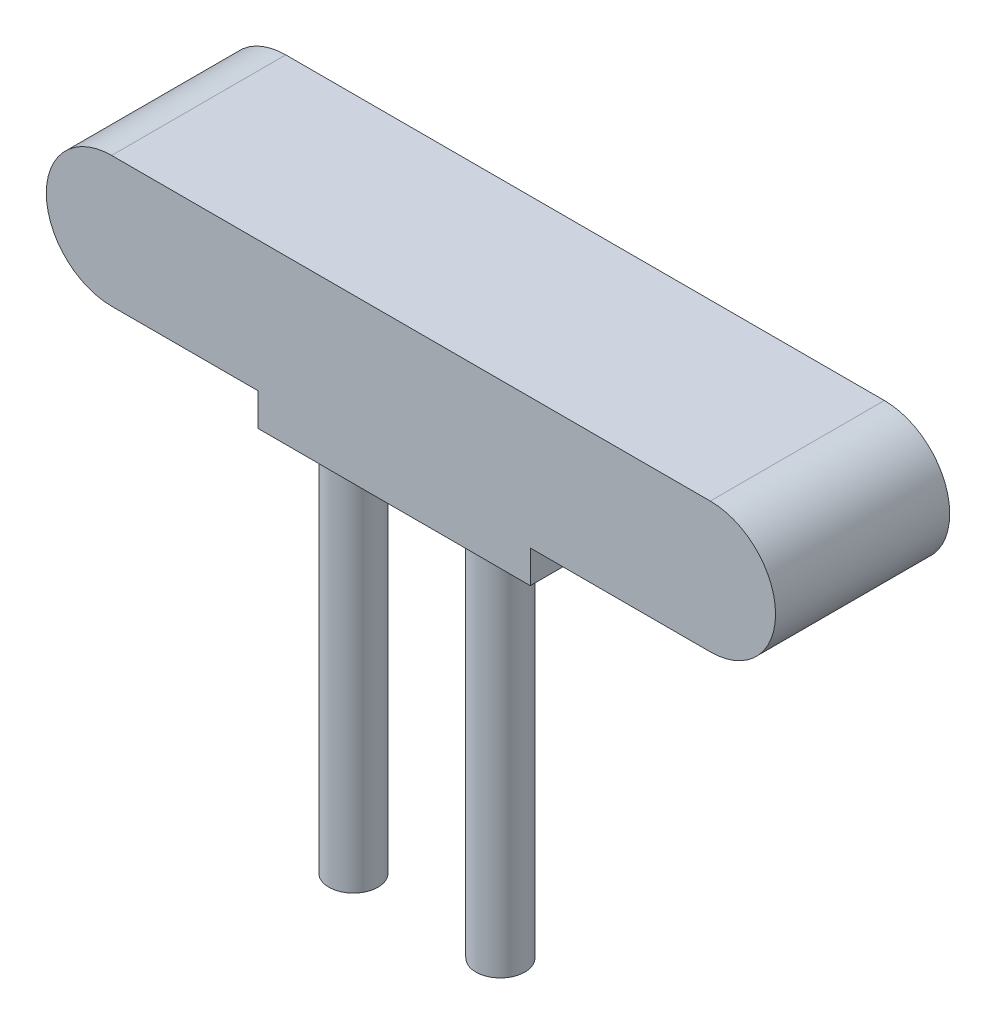
ISO-10303-21;
HEADER;
FILE_DESCRIPTION(('STEP AP214'),'2;1');
FILE_NAME('part.step','',(''),(''),'','','');
FILE_SCHEMA(('AUTOMOTIVE_DESIGN { 1 0 10303 214 1 1 1 1 }'));
ENDSEC;
DATA;
#1=APPLICATION_CONTEXT('core data for automotive mechanical design processes');
#2=APPLICATION_PROTOCOL_DEFINITION('international standard','automotive_design',2000,#1);
#3=PRODUCT_CONTEXT('',#1,'mechanical');
#4=PRODUCT('Part','Part','',(#3));
#5=PRODUCT_RELATED_PRODUCT_CATEGORY('part','',(#4));
#6=PRODUCT_DEFINITION_FORMATION('','',#4);
#7=PRODUCT_DEFINITION_CONTEXT('part definition',#1,'design');
#8=PRODUCT_DEFINITION('design','',#6,#7);
#9=PRODUCT_DEFINITION_SHAPE('','',#8);
#10=(LENGTH_UNIT() NAMED_UNIT(*) SI_UNIT(.MILLI.,.METRE.));
#11=(NAMED_UNIT(*) PLANE_ANGLE_UNIT() SI_UNIT($,.RADIAN.));
#12=(NAMED_UNIT(*) SI_UNIT($,.STERADIAN.) SOLID_ANGLE_UNIT());
#13=UNCERTAINTY_MEASURE_WITH_UNIT(LENGTH_MEASURE(1.E-05),#10,'distance_accuracy_value','');
#14=(GEOMETRIC_REPRESENTATION_CONTEXT(3) GLOBAL_UNCERTAINTY_ASSIGNED_CONTEXT((#13)) GLOBAL_UNIT_ASSIGNED_CONTEXT((#10,
#11,#12)) REPRESENTATION_CONTEXT('',''));
#15=CARTESIAN_POINT('',(0.,0.,0.));
#16=DIRECTION('',(0.,0.,1.));
#17=DIRECTION('',(1.,0.,0.));
#18=AXIS2_PLACEMENT_3D('',#15,#16,#17);
#19=CARTESIAN_POINT('',(0.,7.62,0.));
#20=DIRECTION('',(1.,0.,0.));
#21=DIRECTION('',(0.,0.,-1.));
#22=AXIS2_PLACEMENT_3D('',#19,#20,#21);
#23=PLANE('',#22);
#24=DIRECTION('',(0.,0.,1.));
#25=VECTOR('',#24,1.);
#26=CARTESIAN_POINT('',(0.,0.,0.));
#27=LINE('',#26,#25);
#28=CARTESIAN_POINT('',(0.,0.,-15.24));
#29=VERTEX_POINT('',#28);
#30=CARTESIAN_POINT('',(0.,0.,0.));
#31=VERTEX_POINT('',#30);
#32=EDGE_CURVE('E159',#29,#31,#27,.T.);
#33=ORIENTED_EDGE('',*,*,#32,.T.);
#34=DIRECTION('',(0.,-1.,0.));
#35=VECTOR('',#34,1.);
#36=CARTESIAN_POINT('',(0.,7.62,0.));
#37=LINE('',#36,#35);
#38=CARTESIAN_POINT('',(0.,7.62,0.));
#39=VERTEX_POINT('',#38);
#40=EDGE_CURVE('E11',#39,#31,#37,.T.);
#41=ORIENTED_EDGE('',*,*,#40,.F.);
#42=DIRECTION('',(0.,0.,1.));
#43=VECTOR('',#42,1.);
#44=CARTESIAN_POINT('',(0.,7.62,0.));
#45=LINE('',#44,#43);
#46=CARTESIAN_POINT('',(0.,7.62,-15.24));
#47=VERTEX_POINT('',#46);
#48=EDGE_CURVE('E163',#47,#39,#45,.T.);
#49=ORIENTED_EDGE('',*,*,#48,.F.);
#50=DIRECTION('',(0.,-1.,0.));
#51=VECTOR('',#50,1.);
#52=CARTESIAN_POINT('',(0.,7.62,-15.24));
#53=LINE('',#52,#51);
#54=EDGE_CURVE('E59',#47,#29,#53,.T.);
#55=ORIENTED_EDGE('',*,*,#54,.T.);
#56=EDGE_LOOP('',(#33,#41,#49,#55));
#57=FACE_BOUND('',#56,.T.);
#58=ADVANCED_FACE('F43',(#57),#23,.F.);
#59=CARTESIAN_POINT('',(0.,7.62,0.));
#60=DIRECTION('',(0.,0.,-1.));
#61=DIRECTION('',(-1.,0.,0.));
#62=AXIS2_PLACEMENT_3D('',#59,#60,#61);
#63=PLANE('',#62);
#64=DIRECTION('',(1.,0.,0.));
#65=VECTOR('',#64,1.);
#66=CARTESIAN_POINT('',(0.,0.,0.));
#67=LINE('',#66,#65);
#68=CARTESIAN_POINT('',(63.5,0.,0.));
#69=VERTEX_POINT('',#68);
#70=EDGE_CURVE('E172',#31,#69,#67,.T.);
#71=ORIENTED_EDGE('',*,*,#70,.T.);
#72=DIRECTION('',(0.,-1.,0.));
#73=VECTOR('',#72,1.);
#74=CARTESIAN_POINT('',(63.5,7.62,0.));
#75=LINE('',#74,#73);
#76=CARTESIAN_POINT('',(63.5,7.62,0.));
#77=VERTEX_POINT('',#76);
#78=EDGE_CURVE('E51',#77,#69,#75,.T.);
#79=ORIENTED_EDGE('',*,*,#78,.F.);
#80=DIRECTION('',(1.,0.,0.));
#81=VECTOR('',#80,1.);
#82=CARTESIAN_POINT('',(-34.2099732002428,7.62,0.));
#83=LINE('',#82,#81);
#84=CARTESIAN_POINT('',(105.490026799757,7.62,0.));
#85=VERTEX_POINT('',#84);
#86=EDGE_CURVE('E153',#77,#85,#83,.T.);
#87=ORIENTED_EDGE('',*,*,#86,.T.);
#88=CARTESIAN_POINT('',(105.490026799757,22.86,0.));
#89=DIRECTION('',(0.,0.,1.));
#90=DIRECTION('',(1.,0.,0.));
#91=AXIS2_PLACEMENT_3D('',#88,#89,#90);
#92=CIRCLE('',#91,15.24);
#93=CARTESIAN_POINT('',(105.490026799757,38.1,0.));
#94=VERTEX_POINT('',#93);
#95=EDGE_CURVE('E143',#85,#94,#92,.T.);
#96=ORIENTED_EDGE('',*,*,#95,.T.);
#97=DIRECTION('',(-1.,0.,0.));
#98=VECTOR('',#97,1.);
#99=CARTESIAN_POINT('',(-34.2099732002428,38.1,0.));
#100=LINE('',#99,#98);
#101=CARTESIAN_POINT('',(-34.2099732002428,38.1,0.));
#102=VERTEX_POINT('',#101);
#103=EDGE_CURVE('E140',#94,#102,#100,.T.);
#104=ORIENTED_EDGE('',*,*,#103,.T.);
#105=CARTESIAN_POINT('',(-34.2099732002428,22.86,0.));
#106=DIRECTION('',(0.,0.,1.));
#107=DIRECTION('',(1.,0.,0.));
#108=AXIS2_PLACEMENT_3D('',#105,#106,#107);
#109=CIRCLE('',#108,15.24);
#110=CARTESIAN_POINT('',(-34.2099732002428,7.62,0.));
#111=VERTEX_POINT('',#110);
#112=EDGE_CURVE('E151',#102,#111,#109,.T.);
#113=ORIENTED_EDGE('',*,*,#112,.T.);
#114=EDGE_CURVE('E120',#111,#39,#83,.T.);
#115=ORIENTED_EDGE('',*,*,#114,.T.);
#116=ORIENTED_EDGE('',*,*,#40,.T.);
#117=EDGE_LOOP('',(#71,#79,#87,#96,#104,#113,#115,#116));
#118=FACE_BOUND('',#117,.T.);
#119=ADVANCED_FACE('F195',(#118),#63,.F.);
#120=CARTESIAN_POINT('',(63.5,7.62,0.));
#121=DIRECTION('',(-1.,0.,0.));
#122=DIRECTION('',(0.,0.,1.));
#123=AXIS2_PLACEMENT_3D('',#120,#121,#122);
#124=PLANE('',#123);
#125=DIRECTION('',(0.,0.,-1.));
#126=VECTOR('',#125,1.);
#127=CARTESIAN_POINT('',(63.5,0.,0.));
#128=LINE('',#127,#126);
#129=CARTESIAN_POINT('',(63.5,0.,-15.24));
#130=VERTEX_POINT('',#129);
#131=EDGE_CURVE('E77',#69,#130,#128,.T.);
#132=ORIENTED_EDGE('',*,*,#131,.T.);
#133=DIRECTION('',(0.,-1.,0.));
#134=VECTOR('',#133,1.);
#135=CARTESIAN_POINT('',(63.5,7.62,-15.24));
#136=LINE('',#135,#134);
#137=CARTESIAN_POINT('',(63.5,7.62,-15.24));
#138=VERTEX_POINT('',#137);
#139=EDGE_CURVE('E177',#138,#130,#136,.T.);
#140=ORIENTED_EDGE('',*,*,#139,.F.);
#141=DIRECTION('',(0.,0.,-1.));
#142=VECTOR('',#141,1.);
#143=CARTESIAN_POINT('',(63.5,7.62,0.));
#144=LINE('',#143,#142);
#145=EDGE_CURVE('E165',#77,#138,#144,.T.);
#146=ORIENTED_EDGE('',*,*,#145,.F.);
#147=ORIENTED_EDGE('',*,*,#78,.T.);
#148=EDGE_LOOP('',(#132,#140,#146,#147));
#149=FACE_BOUND('',#148,.T.);
#150=ADVANCED_FACE('F179',(#149),#124,.F.);
#151=CARTESIAN_POINT('',(0.,7.62,-15.24));
#152=DIRECTION('',(0.,0.,1.));
#153=DIRECTION('',(1.,0.,0.));
#154=AXIS2_PLACEMENT_3D('',#151,#152,#153);
#155=PLANE('',#154);
#156=DIRECTION('',(-1.,0.,0.));
#157=VECTOR('',#156,1.);
#158=CARTESIAN_POINT('',(0.,0.,-15.24));
#159=LINE('',#158,#157);
#160=EDGE_CURVE('E80',#130,#29,#159,.T.);
#161=ORIENTED_EDGE('',*,*,#160,.T.);
#162=ORIENTED_EDGE('',*,*,#54,.F.);
#163=DIRECTION('',(-1.,0.,0.));
#164=VECTOR('',#163,1.);
#165=CARTESIAN_POINT('',(0.,7.62,-15.24));
#166=LINE('',#165,#164);
#167=EDGE_CURVE('E168',#138,#47,#166,.T.);
#168=ORIENTED_EDGE('',*,*,#167,.F.);
#169=ORIENTED_EDGE('',*,*,#139,.T.);
#170=EDGE_LOOP('',(#161,#162,#168,#169));
#171=FACE_BOUND('',#170,.T.);
#172=ADVANCED_FACE('F185',(#171),#155,.F.);
#173=CARTESIAN_POINT('',(0.,0.,0.));
#174=DIRECTION('',(0.,-1.,0.));
#175=DIRECTION('',(0.,0.,-1.));
#176=AXIS2_PLACEMENT_3D('',#173,#174,#175);
#177=PLANE('',#176);
#178=CARTESIAN_POINT('',(48.895,0.,-7.62));
#179=DIRECTION('',(0.,-1.,0.));
#180=DIRECTION('',(0.,0.,-1.));
#181=AXIS2_PLACEMENT_3D('',#178,#179,#180);
#182=CIRCLE('',#181,5.715);
#183=CARTESIAN_POINT('',(48.895,0.,-13.335));
#184=VERTEX_POINT('',#183);
#185=EDGE_CURVE('E330',#184,#184,#182,.T.);
#186=ORIENTED_EDGE('',*,*,#185,.F.);
#187=EDGE_LOOP('',(#186));
#188=FACE_BOUND('',#187,.T.);
#189=CARTESIAN_POINT('',(14.605,0.,-7.62));
#190=DIRECTION('',(0.,-1.,0.));
#191=DIRECTION('',(0.,0.,-1.));
#192=AXIS2_PLACEMENT_3D('',#189,#190,#191);
#193=CIRCLE('',#192,5.715);
#194=CARTESIAN_POINT('',(14.605,0.,-13.335));
#195=VERTEX_POINT('',#194);
#196=EDGE_CURVE('E146',#195,#195,#193,.T.);
#197=ORIENTED_EDGE('',*,*,#196,.F.);
#198=EDGE_LOOP('',(#197));
#199=FACE_BOUND('',#198,.T.);
#200=ORIENTED_EDGE('',*,*,#32,.F.);
#201=ORIENTED_EDGE('',*,*,#160,.F.);
#202=ORIENTED_EDGE('',*,*,#131,.F.);
#203=ORIENTED_EDGE('',*,*,#70,.F.);
#204=EDGE_LOOP('',(#200,#201,#202,#203));
#205=FACE_BOUND('',#204,.T.);
#206=ADVANCED_FACE('F184',(#188,#199,#205),#177,.T.);
#207=CARTESIAN_POINT('',(-34.2099732002428,7.62,-40.64));
#208=DIRECTION('',(0.,-1.,0.));
#209=DIRECTION('',(1.,0.,0.));
#210=AXIS2_PLACEMENT_3D('',#207,#208,#209);
#211=PLANE('',#210);
#212=ORIENTED_EDGE('',*,*,#48,.T.);
#213=ORIENTED_EDGE('',*,*,#114,.F.);
#214=DIRECTION('',(0.,0.,1.));
#215=VECTOR('',#214,1.);
#216=CARTESIAN_POINT('',(-34.2099732002428,7.62,-40.64));
#217=LINE('',#216,#215);
#218=CARTESIAN_POINT('',(-34.2099732002428,7.62,-40.64));
#219=VERTEX_POINT('',#218);
#220=EDGE_CURVE('E114',#219,#111,#217,.T.);
#221=ORIENTED_EDGE('',*,*,#220,.F.);
#222=DIRECTION('',(1.,0.,0.));
#223=VECTOR('',#222,1.);
#224=CARTESIAN_POINT('',(-34.2099732002428,7.62,-40.64));
#225=LINE('',#224,#223);
#226=CARTESIAN_POINT('',(105.490026799757,7.62,-40.64));
#227=VERTEX_POINT('',#226);
#228=EDGE_CURVE('E118',#219,#227,#225,.T.);
#229=ORIENTED_EDGE('',*,*,#228,.T.);
#230=DIRECTION('',(0.,0.,1.));
#231=VECTOR('',#230,1.);
#232=CARTESIAN_POINT('',(105.490026799757,7.62,-40.64));
#233=LINE('',#232,#231);
#234=EDGE_CURVE('E125',#227,#85,#233,.T.);
#235=ORIENTED_EDGE('',*,*,#234,.T.);
#236=ORIENTED_EDGE('',*,*,#86,.F.);
#237=ORIENTED_EDGE('',*,*,#145,.T.);
#238=ORIENTED_EDGE('',*,*,#167,.T.);
#239=EDGE_LOOP('',(#212,#213,#221,#229,#235,#236,#237,#238));
#240=FACE_BOUND('',#239,.T.);
#241=ADVANCED_FACE('F116',(#240),#211,.T.);
#242=CARTESIAN_POINT('',(-34.2099732002428,22.86,-40.64));
#243=DIRECTION('',(0.,0.,1.));
#244=DIRECTION('',(1.,0.,0.));
#245=AXIS2_PLACEMENT_3D('',#242,#243,#244);
#246=CYLINDRICAL_SURFACE('',#245,15.24);
#247=ORIENTED_EDGE('',*,*,#112,.F.);
#248=DIRECTION('',(0.,0.,1.));
#249=VECTOR('',#248,1.);
#250=CARTESIAN_POINT('',(-34.2099732002428,38.1,-40.64));
#251=LINE('',#250,#249);
#252=CARTESIAN_POINT('',(-34.2099732002428,38.1,-40.64));
#253=VERTEX_POINT('',#252);
#254=EDGE_CURVE('E139',#253,#102,#251,.T.);
#255=ORIENTED_EDGE('',*,*,#254,.F.);
#256=CARTESIAN_POINT('',(-34.2099732002428,22.86,-40.64));
#257=DIRECTION('',(0.,0.,1.));
#258=DIRECTION('',(1.,0.,0.));
#259=AXIS2_PLACEMENT_3D('',#256,#257,#258);
#260=CIRCLE('',#259,15.24);
#261=EDGE_CURVE('E133',#253,#219,#260,.T.);
#262=ORIENTED_EDGE('',*,*,#261,.T.);
#263=ORIENTED_EDGE('',*,*,#220,.T.);
#264=EDGE_LOOP('',(#247,#255,#262,#263));
#265=FACE_BOUND('',#264,.T.);
#266=ADVANCED_FACE('F138',(#265),#246,.T.);
#267=CARTESIAN_POINT('',(-34.2099732002428,38.1,-40.64));
#268=DIRECTION('',(0.,1.,0.));
#269=DIRECTION('',(0.,0.,1.));
#270=AXIS2_PLACEMENT_3D('',#267,#268,#269);
#271=PLANE('',#270);
#272=ORIENTED_EDGE('',*,*,#103,.F.);
#273=DIRECTION('',(0.,0.,1.));
#274=VECTOR('',#273,1.);
#275=CARTESIAN_POINT('',(105.490026799757,38.1,-40.64));
#276=LINE('',#275,#274);
#277=CARTESIAN_POINT('',(105.490026799757,38.1,-40.64));
#278=VERTEX_POINT('',#277);
#279=EDGE_CURVE('E160',#278,#94,#276,.T.);
#280=ORIENTED_EDGE('',*,*,#279,.F.);
#281=DIRECTION('',(-1.,0.,0.));
#282=VECTOR('',#281,1.);
#283=CARTESIAN_POINT('',(-34.2099732002428,38.1,-40.64));
#284=LINE('',#283,#282);
#285=EDGE_CURVE('E126',#278,#253,#284,.T.);
#286=ORIENTED_EDGE('',*,*,#285,.T.);
#287=ORIENTED_EDGE('',*,*,#254,.T.);
#288=EDGE_LOOP('',(#272,#280,#286,#287));
#289=FACE_BOUND('',#288,.T.);
#290=ADVANCED_FACE('F206',(#289),#271,.T.);
#291=CARTESIAN_POINT('',(105.490026799757,22.86,-40.64));
#292=DIRECTION('',(0.,0.,1.));
#293=DIRECTION('',(1.,0.,0.));
#294=AXIS2_PLACEMENT_3D('',#291,#292,#293);
#295=CYLINDRICAL_SURFACE('',#294,15.24);
#296=ORIENTED_EDGE('',*,*,#95,.F.);
#297=ORIENTED_EDGE('',*,*,#234,.F.);
#298=CARTESIAN_POINT('',(105.490026799757,22.86,-40.64));
#299=DIRECTION('',(0.,0.,1.));
#300=DIRECTION('',(1.,0.,0.));
#301=AXIS2_PLACEMENT_3D('',#298,#299,#300);
#302=CIRCLE('',#301,15.24);
#303=EDGE_CURVE('E136',#227,#278,#302,.T.);
#304=ORIENTED_EDGE('',*,*,#303,.T.);
#305=ORIENTED_EDGE('',*,*,#279,.T.);
#306=EDGE_LOOP('',(#296,#297,#304,#305));
#307=FACE_BOUND('',#306,.T.);
#308=ADVANCED_FACE('F208',(#307),#295,.T.);
#309=CARTESIAN_POINT('',(-34.2099732002428,22.86,-40.64));
#310=DIRECTION('',(0.,0.,1.));
#311=DIRECTION('',(1.,0.,0.));
#312=AXIS2_PLACEMENT_3D('',#309,#310,#311);
#313=PLANE('',#312);
#314=ORIENTED_EDGE('',*,*,#261,.F.);
#315=ORIENTED_EDGE('',*,*,#285,.F.);
#316=ORIENTED_EDGE('',*,*,#303,.F.);
#317=ORIENTED_EDGE('',*,*,#228,.F.);
#318=EDGE_LOOP('',(#314,#315,#316,#317));
#319=FACE_BOUND('',#318,.T.);
#320=ADVANCED_FACE('F131',(#319),#313,.F.);
#321=CARTESIAN_POINT('',(14.605,-86.36,-7.62));
#322=DIRECTION('',(0.,1.,0.));
#323=DIRECTION('',(0.,0.,1.));
#324=AXIS2_PLACEMENT_3D('',#321,#322,#323);
#325=CYLINDRICAL_SURFACE('',#324,5.715);
#326=CARTESIAN_POINT('',(14.605,-86.36,-7.62));
#327=DIRECTION('',(0.,-1.,0.));
#328=DIRECTION('',(0.,0.,-1.));
#329=AXIS2_PLACEMENT_3D('',#326,#327,#328);
#330=CIRCLE('',#329,5.715);
#331=CARTESIAN_POINT('',(14.605,-86.36,-13.335));
#332=VERTEX_POINT('',#331);
#333=EDGE_CURVE('E154',#332,#332,#330,.T.);
#334=ORIENTED_EDGE('',*,*,#333,.F.);
#335=EDGE_LOOP('',(#334));
#336=FACE_BOUND('',#335,.T.);
#337=ORIENTED_EDGE('',*,*,#196,.T.);
#338=EDGE_LOOP('',(#337));
#339=FACE_BOUND('',#338,.T.);
#340=ADVANCED_FACE('F215',(#336,#339),#325,.T.);
#341=CARTESIAN_POINT('',(14.605,-86.36,-7.62));
#342=DIRECTION('',(0.,-1.,0.));
#343=DIRECTION('',(0.,0.,-1.));
#344=AXIS2_PLACEMENT_3D('',#341,#342,#343);
#345=PLANE('',#344);
#346=CARTESIAN_POINT('',(14.605,-86.36,-7.62));
#347=DIRECTION('',(0.,-1.,0.));
#348=DIRECTION('',(0.,0.,-1.));
#349=AXIS2_PLACEMENT_3D('',#346,#347,#348);
#350=CIRCLE('',#349,1.905);
#351=CARTESIAN_POINT('',(14.605,-86.36,-9.525));
#352=VERTEX_POINT('',#351);
#353=EDGE_CURVE('E327',#352,#352,#350,.T.);
#354=ORIENTED_EDGE('',*,*,#353,.F.);
#355=EDGE_LOOP('',(#354));
#356=FACE_BOUND('',#355,.T.);
#357=ORIENTED_EDGE('',*,*,#333,.T.);
#358=EDGE_LOOP('',(#357));
#359=FACE_BOUND('',#358,.T.);
#360=ADVANCED_FACE('F250',(#356,#359),#345,.T.);
#361=CARTESIAN_POINT('',(48.895,-86.36,-7.62));
#362=DIRECTION('',(0.,1.,0.));
#363=DIRECTION('',(0.,0.,1.));
#364=AXIS2_PLACEMENT_3D('',#361,#362,#363);
#365=CYLINDRICAL_SURFACE('',#364,5.715);
#366=CARTESIAN_POINT('',(48.895,-86.36,-7.62));
#367=DIRECTION('',(0.,-1.,0.));
#368=DIRECTION('',(0.,0.,-1.));
#369=AXIS2_PLACEMENT_3D('',#366,#367,#368);
#370=CIRCLE('',#369,5.715);
#371=CARTESIAN_POINT('',(48.895,-86.36,-13.335));
#372=VERTEX_POINT('',#371);
#373=EDGE_CURVE('E326',#372,#372,#370,.T.);
#374=ORIENTED_EDGE('',*,*,#373,.F.);
#375=EDGE_LOOP('',(#374));
#376=FACE_BOUND('',#375,.T.);
#377=ORIENTED_EDGE('',*,*,#185,.T.);
#378=EDGE_LOOP('',(#377));
#379=FACE_BOUND('',#378,.T.);
#380=ADVANCED_FACE('F261',(#376,#379),#365,.T.);
#381=CARTESIAN_POINT('',(48.895,-86.36,-7.62));
#382=DIRECTION('',(0.,-1.,0.));
#383=DIRECTION('',(0.,0.,-1.));
#384=AXIS2_PLACEMENT_3D('',#381,#382,#383);
#385=PLANE('',#384);
#386=CARTESIAN_POINT('',(48.895,-86.36,-7.62));
#387=DIRECTION('',(0.,-1.,0.));
#388=DIRECTION('',(0.,0.,-1.));
#389=AXIS2_PLACEMENT_3D('',#386,#387,#388);
#390=CIRCLE('',#389,1.905);
#391=CARTESIAN_POINT('',(48.895,-86.36,-9.525));
#392=VERTEX_POINT('',#391);
#393=EDGE_CURVE('E333',#392,#392,#390,.T.);
#394=ORIENTED_EDGE('',*,*,#393,.F.);
#395=EDGE_LOOP('',(#394));
#396=FACE_BOUND('',#395,.T.);
#397=ORIENTED_EDGE('',*,*,#373,.T.);
#398=EDGE_LOOP('',(#397));
#399=FACE_BOUND('',#398,.T.);
#400=ADVANCED_FACE('F271',(#396,#399),#385,.T.);
#401=CARTESIAN_POINT('',(48.895,-73.66,-7.62));
#402=DIRECTION('',(0.,-1.,0.));
#403=DIRECTION('',(0.,0.,-1.));
#404=AXIS2_PLACEMENT_3D('',#401,#402,#403);
#405=CYLINDRICAL_SURFACE('',#404,1.905);
#406=CARTESIAN_POINT('',(48.895,-73.66,-7.62));
#407=DIRECTION('',(0.,-1.,0.));
#408=DIRECTION('',(0.,0.,-1.));
#409=AXIS2_PLACEMENT_3D('',#406,#407,#408);
#410=CIRCLE('',#409,1.905);
#411=CARTESIAN_POINT('',(48.895,-73.66,-9.525));
#412=VERTEX_POINT('',#411);
#413=EDGE_CURVE('E338',#412,#412,#410,.T.);
#414=ORIENTED_EDGE('',*,*,#413,.F.);
#415=EDGE_LOOP('',(#414));
#416=FACE_BOUND('',#415,.T.);
#417=ORIENTED_EDGE('',*,*,#393,.T.);
#418=EDGE_LOOP('',(#417));
#419=FACE_BOUND('',#418,.T.);
#420=ADVANCED_FACE('F280',(#416,#419),#405,.F.);
#421=CARTESIAN_POINT('',(48.895,-73.66,-7.62));
#422=DIRECTION('',(0.,-1.,0.));
#423=DIRECTION('',(0.,0.,-1.));
#424=AXIS2_PLACEMENT_3D('',#421,#422,#423);
#425=PLANE('',#424);
#426=ORIENTED_EDGE('',*,*,#413,.T.);
#427=EDGE_LOOP('',(#426));
#428=FACE_BOUND('',#427,.T.);
#429=ADVANCED_FACE('F290',(#428),#425,.T.);
#430=CARTESIAN_POINT('',(14.605,-73.66,-7.62));
#431=DIRECTION('',(0.,-1.,0.));
#432=DIRECTION('',(0.,0.,-1.));
#433=AXIS2_PLACEMENT_3D('',#430,#431,#432);
#434=CYLINDRICAL_SURFACE('',#433,1.905);
#435=CARTESIAN_POINT('',(14.605,-73.66,-7.62));
#436=DIRECTION('',(0.,-1.,0.));
#437=DIRECTION('',(0.,0.,-1.));
#438=AXIS2_PLACEMENT_3D('',#435,#436,#437);
#439=CIRCLE('',#438,1.905);
#440=CARTESIAN_POINT('',(14.605,-73.66,-9.525));
#441=VERTEX_POINT('',#440);
#442=EDGE_CURVE('E325',#441,#441,#439,.T.);
#443=ORIENTED_EDGE('',*,*,#442,.F.);
#444=EDGE_LOOP('',(#443));
#445=FACE_BOUND('',#444,.T.);
#446=ORIENTED_EDGE('',*,*,#353,.T.);
#447=EDGE_LOOP('',(#446));
#448=FACE_BOUND('',#447,.T.);
#449=ADVANCED_FACE('F300',(#445,#448),#434,.F.);
#450=CARTESIAN_POINT('',(14.605,-73.66,-7.62));
#451=DIRECTION('',(0.,-1.,0.));
#452=DIRECTION('',(0.,0.,-1.));
#453=AXIS2_PLACEMENT_3D('',#450,#451,#452);
#454=PLANE('',#453);
#455=ORIENTED_EDGE('',*,*,#442,.T.);
#456=EDGE_LOOP('',(#455));
#457=FACE_BOUND('',#456,.T.);
#458=ADVANCED_FACE('F310',(#457),#454,.T.);
#459=CLOSED_SHELL('',(#58,#119,#150,#172,#206,#241,#266,#290,#308,#320,#340,#360,#380,#400,#420,
#429,#449,#458));
#460=MANIFOLD_SOLID_BREP('B2',#459);
#461=ADVANCED_BREP_SHAPE_REPRESENTATION('',(#18,#460),#14);
#462=SHAPE_DEFINITION_REPRESENTATION(#9,#461);
ENDSEC;
END-ISO-10303-21;
